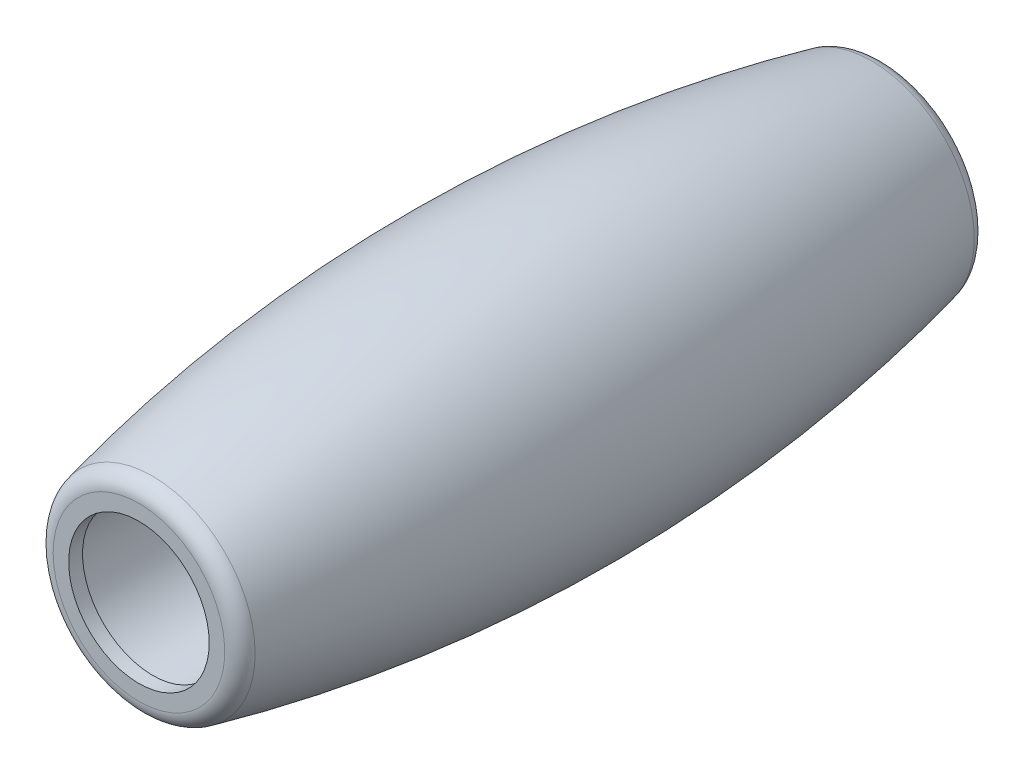
ISO-10303-21;
HEADER;
FILE_DESCRIPTION(('STEP AP214'),'2;1');
FILE_NAME('part.step','',(''),(''),'','','');
FILE_SCHEMA(('AUTOMOTIVE_DESIGN { 1 0 10303 214 1 1 1 1 }'));
ENDSEC;
DATA;
#1=APPLICATION_CONTEXT('core data for automotive mechanical design processes');
#2=APPLICATION_PROTOCOL_DEFINITION('international standard','automotive_design',2000,#1);
#3=PRODUCT_CONTEXT('',#1,'mechanical');
#4=PRODUCT('Part','Part','',(#3));
#5=PRODUCT_RELATED_PRODUCT_CATEGORY('part','',(#4));
#6=PRODUCT_DEFINITION_FORMATION('','',#4);
#7=PRODUCT_DEFINITION_CONTEXT('part definition',#1,'design');
#8=PRODUCT_DEFINITION('design','',#6,#7);
#9=PRODUCT_DEFINITION_SHAPE('','',#8);
#10=(LENGTH_UNIT() NAMED_UNIT(*) SI_UNIT(.MILLI.,.METRE.));
#11=(NAMED_UNIT(*) PLANE_ANGLE_UNIT() SI_UNIT($,.RADIAN.));
#12=(NAMED_UNIT(*) SI_UNIT($,.STERADIAN.) SOLID_ANGLE_UNIT());
#13=UNCERTAINTY_MEASURE_WITH_UNIT(LENGTH_MEASURE(1.E-05),#10,'distance_accuracy_value','');
#14=(GEOMETRIC_REPRESENTATION_CONTEXT(3) GLOBAL_UNCERTAINTY_ASSIGNED_CONTEXT((#13)) GLOBAL_UNIT_ASSIGNED_CONTEXT((#10,
#11,#12)) REPRESENTATION_CONTEXT('',''));
#15=CARTESIAN_POINT('',(0.,0.,0.));
#16=DIRECTION('',(0.,0.,1.));
#17=DIRECTION('',(1.,0.,0.));
#18=AXIS2_PLACEMENT_3D('',#15,#16,#17);
#19=CARTESIAN_POINT('',(0.,0.,0.));
#20=DIRECTION('',(0.,0.,1.));
#21=DIRECTION('',(1.,0.,0.));
#22=AXIS2_PLACEMENT_3D('',#19,#20,#21);
#23=DEGENERATE_TOROIDAL_SURFACE('',#22,85.0327198806462,93.2827198806462,.F.);
#24=CARTESIAN_POINT('',(0.,0.,-20.7221434308234));
#25=DIRECTION('',(0.,0.,1.));
#26=DIRECTION('',(1.,0.,0.));
#27=AXIS2_PLACEMENT_3D('',#24,#25,#26);
#28=CIRCLE('',#27,5.9192377671334);
#29=CARTESIAN_POINT('',(5.9192377671334,0.,-20.7221434308234));
#30=VERTEX_POINT('',#29);
#31=EDGE_CURVE('E41',#30,#30,#28,.T.);
#32=ORIENTED_EDGE('',*,*,#31,.T.);
#33=EDGE_LOOP('',(#32));
#34=FACE_BOUND('',#33,.T.);
#35=CARTESIAN_POINT('',(0.,0.,20.7221434308234));
#36=DIRECTION('',(0.,0.,-1.));
#37=DIRECTION('',(-1.,0.,0.));
#38=AXIS2_PLACEMENT_3D('',#35,#36,#37);
#39=CIRCLE('',#38,5.91923776713339);
#40=CARTESIAN_POINT('',(-5.91923776713339,0.,20.7221434308234));
#41=VERTEX_POINT('',#40);
#42=EDGE_CURVE('E45',#41,#41,#39,.T.);
#43=ORIENTED_EDGE('',*,*,#42,.T.);
#44=EDGE_LOOP('',(#43));
#45=FACE_BOUND('',#44,.T.);
#46=ADVANCED_FACE('F30',(#34,#45),#23,.F.);
#47=CARTESIAN_POINT('',(0.,4.05,21.5));
#48=DIRECTION('',(0.,0.,-1.));
#49=DIRECTION('',(-1.,0.,0.));
#50=AXIS2_PLACEMENT_3D('',#47,#48,#49);
#51=PLANE('',#50);
#52=CARTESIAN_POINT('',(0.,0.,21.5));
#53=DIRECTION('',(0.,0.,-1.));
#54=DIRECTION('',(-1.,0.,0.));
#55=AXIS2_PLACEMENT_3D('',#52,#53,#54);
#56=CIRCLE('',#55,4.94422376921233);
#57=CARTESIAN_POINT('',(-4.94422376921233,0.,21.5));
#58=VERTEX_POINT('',#57);
#59=EDGE_CURVE('E10',#58,#58,#56,.F.);
#60=ORIENTED_EDGE('',*,*,#59,.T.);
#61=EDGE_LOOP('',(#60));
#62=FACE_BOUND('',#61,.T.);
#63=CARTESIAN_POINT('',(0.,0.,21.5));
#64=DIRECTION('',(0.,0.,1.));
#65=DIRECTION('',(1.,0.,0.));
#66=AXIS2_PLACEMENT_3D('',#63,#64,#65);
#67=CIRCLE('',#66,4.05);
#68=CARTESIAN_POINT('',(4.05,0.,21.5));
#69=VERTEX_POINT('',#68);
#70=EDGE_CURVE('E50',#69,#69,#67,.T.);
#71=ORIENTED_EDGE('',*,*,#70,.F.);
#72=EDGE_LOOP('',(#71));
#73=FACE_BOUND('',#72,.T.);
#74=ADVANCED_FACE('F98',(#62,#73),#51,.F.);
#75=CARTESIAN_POINT('',(0.,0.,21.5));
#76=DIRECTION('',(0.,0.,1.));
#77=DIRECTION('',(1.,0.,0.));
#78=AXIS2_PLACEMENT_3D('',#75,#76,#77);
#79=CYLINDRICAL_SURFACE('',#78,4.05);
#80=CARTESIAN_POINT('',(0.,0.,20.7));
#81=DIRECTION('',(0.,0.,1.));
#82=DIRECTION('',(1.,0.,0.));
#83=AXIS2_PLACEMENT_3D('',#80,#81,#82);
#84=CIRCLE('',#83,4.05);
#85=CARTESIAN_POINT('',(4.05,0.,20.7));
#86=VERTEX_POINT('',#85);
#87=EDGE_CURVE('E53',#86,#86,#84,.T.);
#88=ORIENTED_EDGE('',*,*,#87,.F.);
#89=EDGE_LOOP('',(#88));
#90=FACE_BOUND('',#89,.T.);
#91=ORIENTED_EDGE('',*,*,#70,.T.);
#92=EDGE_LOOP('',(#91));
#93=FACE_BOUND('',#92,.T.);
#94=ADVANCED_FACE('F92',(#90,#93),#79,.F.);
#95=CARTESIAN_POINT('',(0.,4.49999999999999,20.7));
#96=DIRECTION('',(0.,0.,1.));
#97=DIRECTION('',(1.,0.,0.));
#98=AXIS2_PLACEMENT_3D('',#95,#96,#97);
#99=PLANE('',#98);
#100=CARTESIAN_POINT('',(0.,0.,20.7));
#101=DIRECTION('',(0.,0.,1.));
#102=DIRECTION('',(1.,0.,0.));
#103=AXIS2_PLACEMENT_3D('',#100,#101,#102);
#104=CIRCLE('',#103,4.49999999999999);
#105=CARTESIAN_POINT('',(4.49999999999999,0.,20.7));
#106=VERTEX_POINT('',#105);
#107=EDGE_CURVE('E56',#106,#106,#104,.T.);
#108=ORIENTED_EDGE('',*,*,#107,.F.);
#109=EDGE_LOOP('',(#108));
#110=FACE_BOUND('',#109,.T.);
#111=ORIENTED_EDGE('',*,*,#87,.T.);
#112=EDGE_LOOP('',(#111));
#113=FACE_BOUND('',#112,.T.);
#114=ADVANCED_FACE('F86',(#110,#113),#99,.F.);
#115=CARTESIAN_POINT('',(0.,0.,21.5));
#116=DIRECTION('',(0.,0.,1.));
#117=DIRECTION('',(1.,0.,0.));
#118=AXIS2_PLACEMENT_3D('',#115,#116,#117);
#119=CYLINDRICAL_SURFACE('',#118,4.5);
#120=CARTESIAN_POINT('',(0.,0.,-20.7));
#121=DIRECTION('',(0.,0.,1.));
#122=DIRECTION('',(1.,0.,0.));
#123=AXIS2_PLACEMENT_3D('',#120,#121,#122);
#124=CIRCLE('',#123,4.5);
#125=CARTESIAN_POINT('',(4.5,0.,-20.7));
#126=VERTEX_POINT('',#125);
#127=EDGE_CURVE('E59',#126,#126,#124,.T.);
#128=ORIENTED_EDGE('',*,*,#127,.F.);
#129=EDGE_LOOP('',(#128));
#130=FACE_BOUND('',#129,.T.);
#131=ORIENTED_EDGE('',*,*,#107,.T.);
#132=EDGE_LOOP('',(#131));
#133=FACE_BOUND('',#132,.T.);
#134=ADVANCED_FACE('F80',(#130,#133),#119,.F.);
#135=CARTESIAN_POINT('',(0.,4.5,-20.7));
#136=DIRECTION('',(0.,0.,-1.));
#137=DIRECTION('',(-1.,0.,0.));
#138=AXIS2_PLACEMENT_3D('',#135,#136,#137);
#139=PLANE('',#138);
#140=CARTESIAN_POINT('',(0.,0.,-20.7));
#141=DIRECTION('',(0.,0.,1.));
#142=DIRECTION('',(1.,0.,0.));
#143=AXIS2_PLACEMENT_3D('',#140,#141,#142);
#144=CIRCLE('',#143,4.05000000000001);
#145=CARTESIAN_POINT('',(4.05000000000001,0.,-20.7));
#146=VERTEX_POINT('',#145);
#147=EDGE_CURVE('E62',#146,#146,#144,.T.);
#148=ORIENTED_EDGE('',*,*,#147,.F.);
#149=EDGE_LOOP('',(#148));
#150=FACE_BOUND('',#149,.T.);
#151=ORIENTED_EDGE('',*,*,#127,.T.);
#152=EDGE_LOOP('',(#151));
#153=FACE_BOUND('',#152,.T.);
#154=ADVANCED_FACE('F74',(#150,#153),#139,.F.);
#155=CARTESIAN_POINT('',(0.,0.,21.5));
#156=DIRECTION('',(0.,0.,1.));
#157=DIRECTION('',(1.,0.,0.));
#158=AXIS2_PLACEMENT_3D('',#155,#156,#157);
#159=CYLINDRICAL_SURFACE('',#158,4.05);
#160=CARTESIAN_POINT('',(0.,0.,-21.5));
#161=DIRECTION('',(0.,0.,1.));
#162=DIRECTION('',(1.,0.,0.));
#163=AXIS2_PLACEMENT_3D('',#160,#161,#162);
#164=CIRCLE('',#163,4.05);
#165=CARTESIAN_POINT('',(4.05,0.,-21.5));
#166=VERTEX_POINT('',#165);
#167=EDGE_CURVE('E65',#166,#166,#164,.T.);
#168=ORIENTED_EDGE('',*,*,#167,.F.);
#169=EDGE_LOOP('',(#168));
#170=FACE_BOUND('',#169,.T.);
#171=ORIENTED_EDGE('',*,*,#147,.T.);
#172=EDGE_LOOP('',(#171));
#173=FACE_BOUND('',#172,.T.);
#174=ADVANCED_FACE('F71',(#170,#173),#159,.F.);
#175=CARTESIAN_POINT('',(0.,5.7385080956851,-21.5));
#176=DIRECTION('',(0.,0.,1.));
#177=DIRECTION('',(1.,0.,0.));
#178=AXIS2_PLACEMENT_3D('',#175,#176,#177);
#179=PLANE('',#178);
#180=CARTESIAN_POINT('',(0.,0.,-21.5));
#181=DIRECTION('',(0.,0.,1.));
#182=DIRECTION('',(1.,0.,0.));
#183=AXIS2_PLACEMENT_3D('',#180,#181,#182);
#184=CIRCLE('',#183,4.94422376921233);
#185=CARTESIAN_POINT('',(4.94422376921233,0.,-21.5));
#186=VERTEX_POINT('',#185);
#187=EDGE_CURVE('E37',#186,#186,#184,.F.);
#188=ORIENTED_EDGE('',*,*,#187,.T.);
#189=EDGE_LOOP('',(#188));
#190=FACE_BOUND('',#189,.T.);
#191=ORIENTED_EDGE('',*,*,#167,.T.);
#192=EDGE_LOOP('',(#191));
#193=FACE_BOUND('',#192,.T.);
#194=ADVANCED_FACE('F69',(#190,#193),#179,.F.);
#195=CARTESIAN_POINT('',(0.,0.,-20.5));
#196=DIRECTION('',(0.,0.,1.));
#197=DIRECTION('',(1.,0.,0.));
#198=AXIS2_PLACEMENT_3D('',#195,#196,#197);
#199=TOROIDAL_SURFACE('',#198,4.94422376921233,1.);
#200=ORIENTED_EDGE('',*,*,#187,.F.);
#201=EDGE_LOOP('',(#200));
#202=FACE_BOUND('',#201,.T.);
#203=ORIENTED_EDGE('',*,*,#31,.F.);
#204=EDGE_LOOP('',(#203));
#205=FACE_BOUND('',#204,.T.);
#206=ADVANCED_FACE('F109',(#202,#205),#199,.T.);
#207=CARTESIAN_POINT('',(0.,0.,20.5));
#208=DIRECTION('',(0.,0.,-1.));
#209=DIRECTION('',(-1.,0.,0.));
#210=AXIS2_PLACEMENT_3D('',#207,#208,#209);
#211=TOROIDAL_SURFACE('',#210,4.94422376921233,1.);
#212=ORIENTED_EDGE('',*,*,#42,.F.);
#213=EDGE_LOOP('',(#212));
#214=FACE_BOUND('',#213,.T.);
#215=ORIENTED_EDGE('',*,*,#59,.F.);
#216=EDGE_LOOP('',(#215));
#217=FACE_BOUND('',#216,.T.);
#218=ADVANCED_FACE('F32',(#214,#217),#211,.T.);
#219=CLOSED_SHELL('',(#46,#74,#94,#114,#134,#154,#174,#194,#206,#218));
#220=MANIFOLD_SOLID_BREP('B2',#219);
#221=ADVANCED_BREP_SHAPE_REPRESENTATION('',(#18,#220),#14);
#222=SHAPE_DEFINITION_REPRESENTATION(#9,#221);
ENDSEC;
END-ISO-10303-21;
